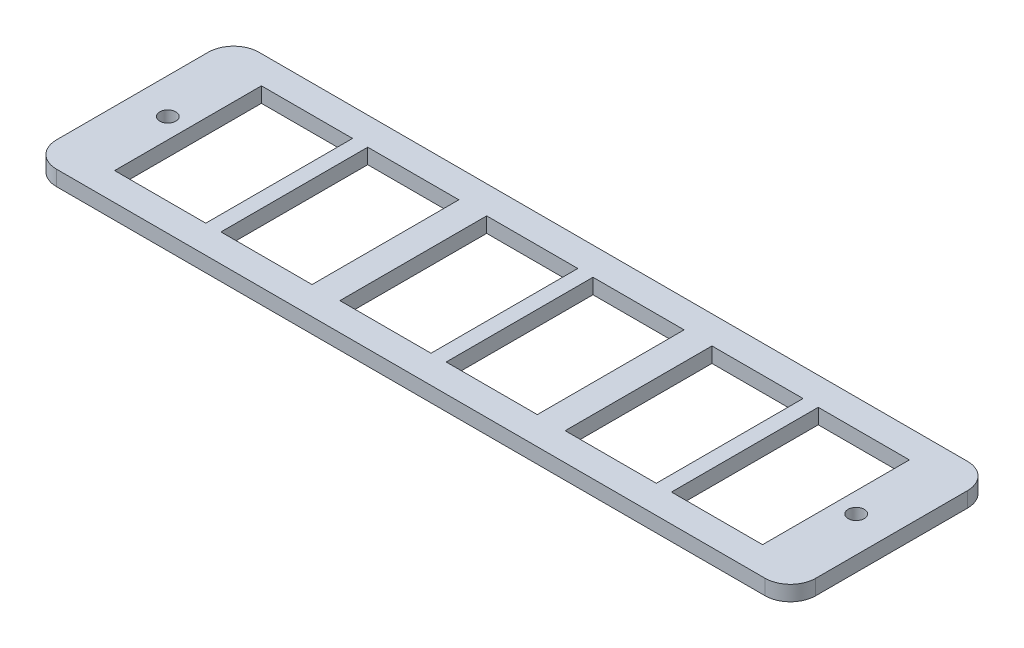
ISO-10303-21;
HEADER;
FILE_DESCRIPTION(('STEP AP214'),'2;1');
FILE_NAME('part.step','',(''),(''),'','','');
FILE_SCHEMA(('AUTOMOTIVE_DESIGN { 1 0 10303 214 1 1 1 1 }'));
ENDSEC;
DATA;
#1=APPLICATION_CONTEXT('core data for automotive mechanical design processes');
#2=APPLICATION_PROTOCOL_DEFINITION('international standard','automotive_design',2000,#1);
#3=PRODUCT_CONTEXT('',#1,'mechanical');
#4=PRODUCT('Part','Part','',(#3));
#5=PRODUCT_RELATED_PRODUCT_CATEGORY('part','',(#4));
#6=PRODUCT_DEFINITION_FORMATION('','',#4);
#7=PRODUCT_DEFINITION_CONTEXT('part definition',#1,'design');
#8=PRODUCT_DEFINITION('design','',#6,#7);
#9=PRODUCT_DEFINITION_SHAPE('','',#8);
#10=(LENGTH_UNIT() NAMED_UNIT(*) SI_UNIT(.MILLI.,.METRE.));
#11=(NAMED_UNIT(*) PLANE_ANGLE_UNIT() SI_UNIT($,.RADIAN.));
#12=(NAMED_UNIT(*) SI_UNIT($,.STERADIAN.) SOLID_ANGLE_UNIT());
#13=UNCERTAINTY_MEASURE_WITH_UNIT(LENGTH_MEASURE(1.E-05),#10,'distance_accuracy_value','');
#14=(GEOMETRIC_REPRESENTATION_CONTEXT(3) GLOBAL_UNCERTAINTY_ASSIGNED_CONTEXT((#13)) GLOBAL_UNIT_ASSIGNED_CONTEXT((#10,
#11,#12)) REPRESENTATION_CONTEXT('',''));
#15=CARTESIAN_POINT('',(0.,0.,0.));
#16=DIRECTION('',(0.,0.,1.));
#17=DIRECTION('',(1.,0.,0.));
#18=AXIS2_PLACEMENT_3D('',#15,#16,#17);
#19=CARTESIAN_POINT('',(0.,3.,0.));
#20=DIRECTION('',(0.,1.,0.));
#21=DIRECTION('',(0.,0.,1.));
#22=AXIS2_PLACEMENT_3D('',#19,#20,#21);
#23=PLANE('',#22);
#24=DIRECTION('',(0.,0.,-1.));
#25=VECTOR('',#24,1.);
#26=CARTESIAN_POINT('',(118.000000002136,3.,-10.4999999991346));
#27=LINE('',#26,#25);
#28=CARTESIAN_POINT('',(118.000000002136,3.,-10.4999999991346));
#29=VERTEX_POINT('',#28);
#30=CARTESIAN_POINT('',(118.000000002136,3.,-39.5));
#31=VERTEX_POINT('',#30);
#32=EDGE_CURVE('E287',#29,#31,#27,.T.);
#33=ORIENTED_EDGE('',*,*,#32,.F.);
#34=DIRECTION('',(1.,0.,0.));
#35=VECTOR('',#34,1.);
#36=CARTESIAN_POINT('',(100.000000002136,3.,-10.4999999991346));
#37=LINE('',#36,#35);
#38=CARTESIAN_POINT('',(100.000000002136,3.,-10.4999999991346));
#39=VERTEX_POINT('',#38);
#40=EDGE_CURVE('E285',#39,#29,#37,.T.);
#41=ORIENTED_EDGE('',*,*,#40,.F.);
#42=DIRECTION('',(0.,0.,1.));
#43=VECTOR('',#42,1.);
#44=CARTESIAN_POINT('',(100.000000002136,3.,-39.5));
#45=LINE('',#44,#43);
#46=CARTESIAN_POINT('',(100.000000002136,3.,-39.5));
#47=VERTEX_POINT('',#46);
#48=EDGE_CURVE('E293',#47,#39,#45,.T.);
#49=ORIENTED_EDGE('',*,*,#48,.F.);
#50=DIRECTION('',(-1.,0.,0.));
#51=VECTOR('',#50,1.);
#52=CARTESIAN_POINT('',(118.000000002136,3.,-39.5));
#53=LINE('',#52,#51);
#54=EDGE_CURVE('E290',#31,#47,#53,.T.);
#55=ORIENTED_EDGE('',*,*,#54,.F.);
#56=EDGE_LOOP('',(#33,#41,#49,#55));
#57=FACE_BOUND('',#56,.T.);
#58=CARTESIAN_POINT('',(143.,3.,-25.));
#59=DIRECTION('',(0.,1.,0.));
#60=DIRECTION('',(0.,0.,-1.));
#61=AXIS2_PLACEMENT_3D('',#58,#59,#60);
#62=CIRCLE('',#61,1.59999999999996);
#63=CARTESIAN_POINT('',(143.,3.,-26.6));
#64=VERTEX_POINT('',#63);
#65=EDGE_CURVE('E347',#64,#64,#62,.T.);
#66=ORIENTED_EDGE('',*,*,#65,.F.);
#67=EDGE_LOOP('',(#66));
#68=FACE_BOUND('',#67,.T.);
#69=DIRECTION('',(0.,0.,1.));
#70=VECTOR('',#69,1.);
#71=CARTESIAN_POINT('',(55.5,3.,-10.4999999991346));
#72=LINE('',#71,#70);
#73=CARTESIAN_POINT('',(55.5,3.,-39.5));
#74=VERTEX_POINT('',#73);
#75=CARTESIAN_POINT('',(55.5,3.,-10.4999999991346));
#76=VERTEX_POINT('',#75);
#77=EDGE_CURVE('E361',#74,#76,#72,.T.);
#78=ORIENTED_EDGE('',*,*,#77,.F.);
#79=DIRECTION('',(-1.,0.,0.));
#80=VECTOR('',#79,1.);
#81=CARTESIAN_POINT('',(55.5,3.,-39.5));
#82=LINE('',#81,#80);
#83=CARTESIAN_POINT('',(73.5,3.,-39.5));
#84=VERTEX_POINT('',#83);
#85=EDGE_CURVE('E359',#84,#74,#82,.T.);
#86=ORIENTED_EDGE('',*,*,#85,.F.);
#87=DIRECTION('',(0.,0.,-1.));
#88=VECTOR('',#87,1.);
#89=CARTESIAN_POINT('',(73.5,3.,-39.5));
#90=LINE('',#89,#88);
#91=CARTESIAN_POINT('',(73.5,3.,-10.4999999991346));
#92=VERTEX_POINT('',#91);
#93=EDGE_CURVE('E367',#92,#84,#90,.T.);
#94=ORIENTED_EDGE('',*,*,#93,.F.);
#95=DIRECTION('',(1.,0.,0.));
#96=VECTOR('',#95,1.);
#97=CARTESIAN_POINT('',(73.5,3.,-10.4999999991346));
#98=LINE('',#97,#96);
#99=EDGE_CURVE('E364',#76,#92,#98,.T.);
#100=ORIENTED_EDGE('',*,*,#99,.F.);
#101=EDGE_LOOP('',(#78,#86,#94,#100));
#102=FACE_BOUND('',#101,.T.);
#103=DIRECTION('',(0.,0.,-1.));
#104=VECTOR('',#103,1.);
#105=CARTESIAN_POINT('',(28.9999999978636,3.,-39.5));
#106=LINE('',#105,#104);
#107=CARTESIAN_POINT('',(28.9999999978636,3.,-10.4999999991346));
#108=VERTEX_POINT('',#107);
#109=CARTESIAN_POINT('',(28.9999999978636,3.,-39.5));
#110=VERTEX_POINT('',#109);
#111=EDGE_CURVE('E423',#108,#110,#106,.T.);
#112=ORIENTED_EDGE('',*,*,#111,.F.);
#113=DIRECTION('',(1.,0.,0.));
#114=VECTOR('',#113,1.);
#115=CARTESIAN_POINT('',(28.9999999978636,3.,-10.4999999991346));
#116=LINE('',#115,#114);
#117=CARTESIAN_POINT('',(10.9999999978636,3.,-10.4999999991346));
#118=VERTEX_POINT('',#117);
#119=EDGE_CURVE('E421',#118,#108,#116,.T.);
#120=ORIENTED_EDGE('',*,*,#119,.F.);
#121=DIRECTION('',(0.,0.,1.));
#122=VECTOR('',#121,1.);
#123=CARTESIAN_POINT('',(10.9999999978636,3.,-10.4999999991346));
#124=LINE('',#123,#122);
#125=CARTESIAN_POINT('',(10.9999999978636,3.,-39.5));
#126=VERTEX_POINT('',#125);
#127=EDGE_CURVE('E429',#126,#118,#124,.T.);
#128=ORIENTED_EDGE('',*,*,#127,.F.);
#129=DIRECTION('',(-1.,0.,0.));
#130=VECTOR('',#129,1.);
#131=CARTESIAN_POINT('',(10.9999999978636,3.,-39.5));
#132=LINE('',#131,#130);
#133=EDGE_CURVE('E426',#110,#126,#132,.T.);
#134=ORIENTED_EDGE('',*,*,#133,.F.);
#135=EDGE_LOOP('',(#112,#120,#128,#134));
#136=FACE_BOUND('',#135,.T.);
#137=DIRECTION('',(1.,0.,0.));
#138=VECTOR('',#137,1.);
#139=CARTESIAN_POINT('',(0.,3.,-5.));
#140=LINE('',#139,#138);
#141=CARTESIAN_POINT('',(5.,3.,-5.));
#142=VERTEX_POINT('',#141);
#143=CARTESIAN_POINT('',(145.,3.,-5.));
#144=VERTEX_POINT('',#143);
#145=EDGE_CURVE('E455',#142,#144,#140,.T.);
#146=ORIENTED_EDGE('',*,*,#145,.T.);
#147=CARTESIAN_POINT('',(145.,3.,-10.));
#148=DIRECTION('',(0.,1.,0.));
#149=DIRECTION('',(0.,0.,1.));
#150=AXIS2_PLACEMENT_3D('',#147,#148,#149);
#151=CIRCLE('',#150,5.);
#152=CARTESIAN_POINT('',(150.,3.,-10.));
#153=VERTEX_POINT('',#152);
#154=EDGE_CURVE('E495',#144,#153,#151,.T.);
#155=ORIENTED_EDGE('',*,*,#154,.T.);
#156=DIRECTION('',(0.,0.,-1.));
#157=VECTOR('',#156,1.);
#158=CARTESIAN_POINT('',(150.,3.,-45.));
#159=LINE('',#158,#157);
#160=CARTESIAN_POINT('',(150.,3.,-40.));
#161=VERTEX_POINT('',#160);
#162=EDGE_CURVE('E459',#153,#161,#159,.T.);
#163=ORIENTED_EDGE('',*,*,#162,.T.);
#164=CARTESIAN_POINT('',(145.,3.,-40.));
#165=DIRECTION('',(0.,1.,0.));
#166=DIRECTION('',(0.,0.,1.));
#167=AXIS2_PLACEMENT_3D('',#164,#165,#166);
#168=CIRCLE('',#167,5.);
#169=CARTESIAN_POINT('',(145.,3.,-45.));
#170=VERTEX_POINT('',#169);
#171=EDGE_CURVE('E55',#161,#170,#168,.T.);
#172=ORIENTED_EDGE('',*,*,#171,.T.);
#173=DIRECTION('',(-1.,0.,0.));
#174=VECTOR('',#173,1.);
#175=CARTESIAN_POINT('',(0.,3.,-45.));
#176=LINE('',#175,#174);
#177=CARTESIAN_POINT('',(5.,3.,-45.));
#178=VERTEX_POINT('',#177);
#179=EDGE_CURVE('E461',#170,#178,#176,.T.);
#180=ORIENTED_EDGE('',*,*,#179,.T.);
#181=CARTESIAN_POINT('',(5.,3.,-40.));
#182=DIRECTION('',(0.,1.,0.));
#183=DIRECTION('',(0.,0.,1.));
#184=AXIS2_PLACEMENT_3D('',#181,#182,#183);
#185=CIRCLE('',#184,5.);
#186=CARTESIAN_POINT('',(0.,3.,-40.));
#187=VERTEX_POINT('',#186);
#188=EDGE_CURVE('E490',#178,#187,#185,.T.);
#189=ORIENTED_EDGE('',*,*,#188,.T.);
#190=DIRECTION('',(0.,0.,1.));
#191=VECTOR('',#190,1.);
#192=CARTESIAN_POINT('',(0.,3.,-45.));
#193=LINE('',#192,#191);
#194=CARTESIAN_POINT('',(0.,3.,-10.));
#195=VERTEX_POINT('',#194);
#196=EDGE_CURVE('E452',#187,#195,#193,.T.);
#197=ORIENTED_EDGE('',*,*,#196,.T.);
#198=CARTESIAN_POINT('',(5.,3.,-10.));
#199=DIRECTION('',(0.,1.,0.));
#200=DIRECTION('',(0.,0.,1.));
#201=AXIS2_PLACEMENT_3D('',#198,#199,#200);
#202=CIRCLE('',#201,5.);
#203=EDGE_CURVE('E492',#195,#142,#202,.T.);
#204=ORIENTED_EDGE('',*,*,#203,.T.);
#205=EDGE_LOOP('',(#146,#155,#163,#172,#180,#189,#197,#204));
#206=FACE_BOUND('',#205,.T.);
#207=DIRECTION('',(0.,0.,-1.));
#208=VECTOR('',#207,1.);
#209=CARTESIAN_POINT('',(49.9999999978636,3.,-39.5));
#210=LINE('',#209,#208);
#211=CARTESIAN_POINT('',(49.9999999978636,3.,-10.4999999991346));
#212=VERTEX_POINT('',#211);
#213=CARTESIAN_POINT('',(49.9999999978636,3.,-39.5));
#214=VERTEX_POINT('',#213);
#215=EDGE_CURVE('E392',#212,#214,#210,.T.);
#216=ORIENTED_EDGE('',*,*,#215,.F.);
#217=DIRECTION('',(1.,0.,0.));
#218=VECTOR('',#217,1.);
#219=CARTESIAN_POINT('',(49.9999999978636,3.,-10.4999999991346));
#220=LINE('',#219,#218);
#221=CARTESIAN_POINT('',(31.9999999978636,3.,-10.4999999991346));
#222=VERTEX_POINT('',#221);
#223=EDGE_CURVE('E390',#222,#212,#220,.T.);
#224=ORIENTED_EDGE('',*,*,#223,.F.);
#225=DIRECTION('',(0.,0.,1.));
#226=VECTOR('',#225,1.);
#227=CARTESIAN_POINT('',(31.9999999978636,3.,-10.4999999991346));
#228=LINE('',#227,#226);
#229=CARTESIAN_POINT('',(31.9999999978636,3.,-39.5));
#230=VERTEX_POINT('',#229);
#231=EDGE_CURVE('E398',#230,#222,#228,.T.);
#232=ORIENTED_EDGE('',*,*,#231,.F.);
#233=DIRECTION('',(-1.,0.,0.));
#234=VECTOR('',#233,1.);
#235=CARTESIAN_POINT('',(31.9999999978636,3.,-39.5));
#236=LINE('',#235,#234);
#237=EDGE_CURVE('E395',#214,#230,#236,.T.);
#238=ORIENTED_EDGE('',*,*,#237,.F.);
#239=EDGE_LOOP('',(#216,#224,#232,#238));
#240=FACE_BOUND('',#239,.T.);
#241=CARTESIAN_POINT('',(7.,3.,-25.));
#242=DIRECTION('',(0.,1.,0.));
#243=DIRECTION('',(0.,0.,1.));
#244=AXIS2_PLACEMENT_3D('',#241,#242,#243);
#245=CIRCLE('',#244,1.6);
#246=CARTESIAN_POINT('',(7.,3.,-23.4));
#247=VERTEX_POINT('',#246);
#248=EDGE_CURVE('E353',#247,#247,#245,.T.);
#249=ORIENTED_EDGE('',*,*,#248,.F.);
#250=EDGE_LOOP('',(#249));
#251=FACE_BOUND('',#250,.T.);
#252=DIRECTION('',(0.,0.,1.));
#253=VECTOR('',#252,1.);
#254=CARTESIAN_POINT('',(76.5,3.,-39.5));
#255=LINE('',#254,#253);
#256=CARTESIAN_POINT('',(76.5,3.,-39.5));
#257=VERTEX_POINT('',#256);
#258=CARTESIAN_POINT('',(76.5,3.,-10.4999999991346));
#259=VERTEX_POINT('',#258);
#260=EDGE_CURVE('E318',#257,#259,#255,.T.);
#261=ORIENTED_EDGE('',*,*,#260,.F.);
#262=DIRECTION('',(-1.,0.,0.));
#263=VECTOR('',#262,1.);
#264=CARTESIAN_POINT('',(94.5,3.,-39.5));
#265=LINE('',#264,#263);
#266=CARTESIAN_POINT('',(94.5,3.,-39.5));
#267=VERTEX_POINT('',#266);
#268=EDGE_CURVE('E316',#267,#257,#265,.T.);
#269=ORIENTED_EDGE('',*,*,#268,.F.);
#270=DIRECTION('',(0.,0.,-1.));
#271=VECTOR('',#270,1.);
#272=CARTESIAN_POINT('',(94.5,3.,-10.4999999991346));
#273=LINE('',#272,#271);
#274=CARTESIAN_POINT('',(94.5,3.,-10.4999999991346));
#275=VERTEX_POINT('',#274);
#276=EDGE_CURVE('E324',#275,#267,#273,.T.);
#277=ORIENTED_EDGE('',*,*,#276,.F.);
#278=DIRECTION('',(1.,0.,0.));
#279=VECTOR('',#278,1.);
#280=CARTESIAN_POINT('',(76.5,3.,-10.4999999991346));
#281=LINE('',#280,#279);
#282=EDGE_CURVE('E321',#259,#275,#281,.T.);
#283=ORIENTED_EDGE('',*,*,#282,.F.);
#284=EDGE_LOOP('',(#261,#269,#277,#283));
#285=FACE_BOUND('',#284,.T.);
#286=DIRECTION('',(0.,0.,-1.));
#287=VECTOR('',#286,1.);
#288=CARTESIAN_POINT('',(139.000000002136,3.,-10.4999999991346));
#289=LINE('',#288,#287);
#290=CARTESIAN_POINT('',(139.000000002136,3.,-10.4999999991346));
#291=VERTEX_POINT('',#290);
#292=CARTESIAN_POINT('',(139.000000002136,3.,-39.5));
#293=VERTEX_POINT('',#292);
#294=EDGE_CURVE('E254',#291,#293,#289,.T.);
#295=ORIENTED_EDGE('',*,*,#294,.F.);
#296=DIRECTION('',(1.,0.,0.));
#297=VECTOR('',#296,1.);
#298=CARTESIAN_POINT('',(121.000000002136,3.,-10.4999999991346));
#299=LINE('',#298,#297);
#300=CARTESIAN_POINT('',(121.000000002136,3.,-10.4999999991346));
#301=VERTEX_POINT('',#300);
#302=EDGE_CURVE('E244',#301,#291,#299,.T.);
#303=ORIENTED_EDGE('',*,*,#302,.F.);
#304=DIRECTION('',(0.,0.,1.));
#305=VECTOR('',#304,1.);
#306=CARTESIAN_POINT('',(121.000000002136,3.,-39.5));
#307=LINE('',#306,#305);
#308=CARTESIAN_POINT('',(121.000000002136,3.,-39.5));
#309=VERTEX_POINT('',#308);
#310=EDGE_CURVE('E269',#309,#301,#307,.T.);
#311=ORIENTED_EDGE('',*,*,#310,.F.);
#312=DIRECTION('',(-1.,0.,0.));
#313=VECTOR('',#312,1.);
#314=CARTESIAN_POINT('',(139.000000002136,3.,-39.5));
#315=LINE('',#314,#313);
#316=EDGE_CURVE('E267',#293,#309,#315,.T.);
#317=ORIENTED_EDGE('',*,*,#316,.F.);
#318=EDGE_LOOP('',(#295,#303,#311,#317));
#319=FACE_BOUND('',#318,.T.);
#320=ADVANCED_FACE('F33',(#57,#68,#102,#136,#206,#240,#251,#285,#319),#23,.T.);
#321=CARTESIAN_POINT('',(0.,0.,0.));
#322=DIRECTION('',(0.,1.,0.));
#323=DIRECTION('',(0.,0.,1.));
#324=AXIS2_PLACEMENT_3D('',#321,#322,#323);
#325=PLANE('',#324);
#326=DIRECTION('',(1.,0.,0.));
#327=VECTOR('',#326,1.);
#328=CARTESIAN_POINT('',(100.000000002136,0.,-10.4999999991346));
#329=LINE('',#328,#327);
#330=CARTESIAN_POINT('',(100.000000002136,0.,-10.4999999991346));
#331=VERTEX_POINT('',#330);
#332=CARTESIAN_POINT('',(118.000000002136,0.,-10.4999999991346));
#333=VERTEX_POINT('',#332);
#334=EDGE_CURVE('E262',#331,#333,#329,.T.);
#335=ORIENTED_EDGE('',*,*,#334,.T.);
#336=DIRECTION('',(0.,0.,-1.));
#337=VECTOR('',#336,1.);
#338=CARTESIAN_POINT('',(118.000000002136,0.,-10.4999999991346));
#339=LINE('',#338,#337);
#340=CARTESIAN_POINT('',(118.000000002136,0.,-39.5));
#341=VERTEX_POINT('',#340);
#342=EDGE_CURVE('E298',#333,#341,#339,.T.);
#343=ORIENTED_EDGE('',*,*,#342,.T.);
#344=DIRECTION('',(-1.,0.,0.));
#345=VECTOR('',#344,1.);
#346=CARTESIAN_POINT('',(118.000000002136,0.,-39.5));
#347=LINE('',#346,#345);
#348=CARTESIAN_POINT('',(100.000000002136,0.,-39.5));
#349=VERTEX_POINT('',#348);
#350=EDGE_CURVE('E301',#341,#349,#347,.T.);
#351=ORIENTED_EDGE('',*,*,#350,.T.);
#352=DIRECTION('',(0.,0.,1.));
#353=VECTOR('',#352,1.);
#354=CARTESIAN_POINT('',(100.000000002136,0.,-39.5));
#355=LINE('',#354,#353);
#356=EDGE_CURVE('E288',#349,#331,#355,.T.);
#357=ORIENTED_EDGE('',*,*,#356,.T.);
#358=EDGE_LOOP('',(#335,#343,#351,#357));
#359=FACE_BOUND('',#358,.T.);
#360=CARTESIAN_POINT('',(143.,0.,-25.));
#361=DIRECTION('',(0.,1.,0.));
#362=DIRECTION('',(0.,0.,-1.));
#363=AXIS2_PLACEMENT_3D('',#360,#361,#362);
#364=CIRCLE('',#363,1.59999999999996);
#365=CARTESIAN_POINT('',(143.,0.,-26.6));
#366=VERTEX_POINT('',#365);
#367=EDGE_CURVE('E346',#366,#366,#364,.T.);
#368=ORIENTED_EDGE('',*,*,#367,.T.);
#369=EDGE_LOOP('',(#368));
#370=FACE_BOUND('',#369,.T.);
#371=DIRECTION('',(-1.,0.,0.));
#372=VECTOR('',#371,1.);
#373=CARTESIAN_POINT('',(55.5,0.,-39.5));
#374=LINE('',#373,#372);
#375=CARTESIAN_POINT('',(73.5,0.,-39.5));
#376=VERTEX_POINT('',#375);
#377=CARTESIAN_POINT('',(55.5,0.,-39.5));
#378=VERTEX_POINT('',#377);
#379=EDGE_CURVE('E356',#376,#378,#374,.T.);
#380=ORIENTED_EDGE('',*,*,#379,.T.);
#381=DIRECTION('',(0.,0.,1.));
#382=VECTOR('',#381,1.);
#383=CARTESIAN_POINT('',(55.5,0.,-10.4999999991346));
#384=LINE('',#383,#382);
#385=CARTESIAN_POINT('',(55.5,0.,-10.4999999991346));
#386=VERTEX_POINT('',#385);
#387=EDGE_CURVE('E372',#378,#386,#384,.T.);
#388=ORIENTED_EDGE('',*,*,#387,.T.);
#389=DIRECTION('',(1.,0.,0.));
#390=VECTOR('',#389,1.);
#391=CARTESIAN_POINT('',(73.5,0.,-10.4999999991346));
#392=LINE('',#391,#390);
#393=CARTESIAN_POINT('',(73.5,0.,-10.4999999991346));
#394=VERTEX_POINT('',#393);
#395=EDGE_CURVE('E375',#386,#394,#392,.T.);
#396=ORIENTED_EDGE('',*,*,#395,.T.);
#397=DIRECTION('',(0.,0.,-1.));
#398=VECTOR('',#397,1.);
#399=CARTESIAN_POINT('',(73.5,0.,-39.5));
#400=LINE('',#399,#398);
#401=EDGE_CURVE('E362',#394,#376,#400,.T.);
#402=ORIENTED_EDGE('',*,*,#401,.T.);
#403=EDGE_LOOP('',(#380,#388,#396,#402));
#404=FACE_BOUND('',#403,.T.);
#405=DIRECTION('',(1.,0.,0.));
#406=VECTOR('',#405,1.);
#407=CARTESIAN_POINT('',(28.9999999978636,0.,-10.4999999991346));
#408=LINE('',#407,#406);
#409=CARTESIAN_POINT('',(10.9999999978636,0.,-10.4999999991346));
#410=VERTEX_POINT('',#409);
#411=CARTESIAN_POINT('',(28.9999999978636,0.,-10.4999999991346));
#412=VERTEX_POINT('',#411);
#413=EDGE_CURVE('E420',#410,#412,#408,.T.);
#414=ORIENTED_EDGE('',*,*,#413,.T.);
#415=DIRECTION('',(0.,0.,-1.));
#416=VECTOR('',#415,1.);
#417=CARTESIAN_POINT('',(28.9999999978636,0.,-39.5));
#418=LINE('',#417,#416);
#419=CARTESIAN_POINT('',(28.9999999978636,0.,-39.5));
#420=VERTEX_POINT('',#419);
#421=EDGE_CURVE('E434',#412,#420,#418,.T.);
#422=ORIENTED_EDGE('',*,*,#421,.T.);
#423=DIRECTION('',(-1.,0.,0.));
#424=VECTOR('',#423,1.);
#425=CARTESIAN_POINT('',(10.9999999978636,0.,-39.5));
#426=LINE('',#425,#424);
#427=CARTESIAN_POINT('',(10.9999999978636,0.,-39.5));
#428=VERTEX_POINT('',#427);
#429=EDGE_CURVE('E437',#420,#428,#426,.T.);
#430=ORIENTED_EDGE('',*,*,#429,.T.);
#431=DIRECTION('',(0.,0.,1.));
#432=VECTOR('',#431,1.);
#433=CARTESIAN_POINT('',(10.9999999978636,0.,-10.4999999991346));
#434=LINE('',#433,#432);
#435=EDGE_CURVE('E424',#428,#410,#434,.T.);
#436=ORIENTED_EDGE('',*,*,#435,.T.);
#437=EDGE_LOOP('',(#414,#422,#430,#436));
#438=FACE_BOUND('',#437,.T.);
#439=DIRECTION('',(0.,0.,-1.));
#440=VECTOR('',#439,1.);
#441=CARTESIAN_POINT('',(150.,0.,-45.));
#442=LINE('',#441,#440);
#443=CARTESIAN_POINT('',(150.,0.,-10.));
#444=VERTEX_POINT('',#443);
#445=CARTESIAN_POINT('',(150.,0.,-40.));
#446=VERTEX_POINT('',#445);
#447=EDGE_CURVE('E469',#444,#446,#442,.T.);
#448=ORIENTED_EDGE('',*,*,#447,.F.);
#449=CARTESIAN_POINT('',(145.,0.,-10.));
#450=DIRECTION('',(0.,1.,0.));
#451=DIRECTION('',(0.,0.,1.));
#452=AXIS2_PLACEMENT_3D('',#449,#450,#451);
#453=CIRCLE('',#452,5.);
#454=CARTESIAN_POINT('',(145.,0.,-5.));
#455=VERTEX_POINT('',#454);
#456=EDGE_CURVE('E483',#444,#455,#453,.F.);
#457=ORIENTED_EDGE('',*,*,#456,.T.);
#458=DIRECTION('',(1.,0.,0.));
#459=VECTOR('',#458,1.);
#460=CARTESIAN_POINT('',(0.,0.,-5.));
#461=LINE('',#460,#459);
#462=CARTESIAN_POINT('',(5.,0.,-5.));
#463=VERTEX_POINT('',#462);
#464=EDGE_CURVE('E466',#463,#455,#461,.T.);
#465=ORIENTED_EDGE('',*,*,#464,.F.);
#466=CARTESIAN_POINT('',(5.,0.,-10.));
#467=DIRECTION('',(0.,1.,0.));
#468=DIRECTION('',(0.,0.,1.));
#469=AXIS2_PLACEMENT_3D('',#466,#467,#468);
#470=CIRCLE('',#469,5.);
#471=CARTESIAN_POINT('',(0.,0.,-10.));
#472=VERTEX_POINT('',#471);
#473=EDGE_CURVE('E479',#463,#472,#470,.F.);
#474=ORIENTED_EDGE('',*,*,#473,.T.);
#475=DIRECTION('',(0.,0.,1.));
#476=VECTOR('',#475,1.);
#477=CARTESIAN_POINT('',(0.,0.,-45.));
#478=LINE('',#477,#476);
#479=CARTESIAN_POINT('',(0.,0.,-40.));
#480=VERTEX_POINT('',#479);
#481=EDGE_CURVE('E451',#480,#472,#478,.T.);
#482=ORIENTED_EDGE('',*,*,#481,.F.);
#483=CARTESIAN_POINT('',(5.,0.,-40.));
#484=DIRECTION('',(0.,1.,0.));
#485=DIRECTION('',(0.,0.,1.));
#486=AXIS2_PLACEMENT_3D('',#483,#484,#485);
#487=CIRCLE('',#486,5.);
#488=CARTESIAN_POINT('',(5.,0.,-45.));
#489=VERTEX_POINT('',#488);
#490=EDGE_CURVE('E477',#480,#489,#487,.F.);
#491=ORIENTED_EDGE('',*,*,#490,.T.);
#492=DIRECTION('',(-1.,0.,0.));
#493=VECTOR('',#492,1.);
#494=CARTESIAN_POINT('',(0.,0.,-45.));
#495=LINE('',#494,#493);
#496=CARTESIAN_POINT('',(145.,0.,-45.));
#497=VERTEX_POINT('',#496);
#498=EDGE_CURVE('E456',#497,#489,#495,.T.);
#499=ORIENTED_EDGE('',*,*,#498,.F.);
#500=CARTESIAN_POINT('',(145.,0.,-40.));
#501=DIRECTION('',(0.,1.,0.));
#502=DIRECTION('',(0.,0.,1.));
#503=AXIS2_PLACEMENT_3D('',#500,#501,#502);
#504=CIRCLE('',#503,5.);
#505=EDGE_CURVE('E481',#497,#446,#504,.F.);
#506=ORIENTED_EDGE('',*,*,#505,.T.);
#507=EDGE_LOOP('',(#448,#457,#465,#474,#482,#491,#499,#506));
#508=FACE_BOUND('',#507,.T.);
#509=DIRECTION('',(1.,0.,0.));
#510=VECTOR('',#509,1.);
#511=CARTESIAN_POINT('',(49.9999999978636,0.,-10.4999999991346));
#512=LINE('',#511,#510);
#513=CARTESIAN_POINT('',(31.9999999978636,0.,-10.4999999991346));
#514=VERTEX_POINT('',#513);
#515=CARTESIAN_POINT('',(49.9999999978636,0.,-10.4999999991346));
#516=VERTEX_POINT('',#515);
#517=EDGE_CURVE('E389',#514,#516,#512,.T.);
#518=ORIENTED_EDGE('',*,*,#517,.T.);
#519=DIRECTION('',(0.,0.,-1.));
#520=VECTOR('',#519,1.);
#521=CARTESIAN_POINT('',(49.9999999978636,0.,-39.5));
#522=LINE('',#521,#520);
#523=CARTESIAN_POINT('',(49.9999999978636,0.,-39.5));
#524=VERTEX_POINT('',#523);
#525=EDGE_CURVE('E403',#516,#524,#522,.T.);
#526=ORIENTED_EDGE('',*,*,#525,.T.);
#527=DIRECTION('',(-1.,0.,0.));
#528=VECTOR('',#527,1.);
#529=CARTESIAN_POINT('',(31.9999999978636,0.,-39.5));
#530=LINE('',#529,#528);
#531=CARTESIAN_POINT('',(31.9999999978636,0.,-39.5));
#532=VERTEX_POINT('',#531);
#533=EDGE_CURVE('E406',#524,#532,#530,.T.);
#534=ORIENTED_EDGE('',*,*,#533,.T.);
#535=DIRECTION('',(0.,0.,1.));
#536=VECTOR('',#535,1.);
#537=CARTESIAN_POINT('',(31.9999999978636,0.,-10.4999999991346));
#538=LINE('',#537,#536);
#539=EDGE_CURVE('E393',#532,#514,#538,.T.);
#540=ORIENTED_EDGE('',*,*,#539,.T.);
#541=EDGE_LOOP('',(#518,#526,#534,#540));
#542=FACE_BOUND('',#541,.T.);
#543=CARTESIAN_POINT('',(7.,0.,-25.));
#544=DIRECTION('',(0.,1.,0.));
#545=DIRECTION('',(0.,0.,1.));
#546=AXIS2_PLACEMENT_3D('',#543,#544,#545);
#547=CIRCLE('',#546,1.6);
#548=CARTESIAN_POINT('',(7.,0.,-23.4));
#549=VERTEX_POINT('',#548);
#550=EDGE_CURVE('E350',#549,#549,#547,.T.);
#551=ORIENTED_EDGE('',*,*,#550,.T.);
#552=EDGE_LOOP('',(#551));
#553=FACE_BOUND('',#552,.T.);
#554=DIRECTION('',(-1.,0.,0.));
#555=VECTOR('',#554,1.);
#556=CARTESIAN_POINT('',(94.5,0.,-39.5));
#557=LINE('',#556,#555);
#558=CARTESIAN_POINT('',(94.5,0.,-39.5));
#559=VERTEX_POINT('',#558);
#560=CARTESIAN_POINT('',(76.5,0.,-39.5));
#561=VERTEX_POINT('',#560);
#562=EDGE_CURVE('E315',#559,#561,#557,.T.);
#563=ORIENTED_EDGE('',*,*,#562,.T.);
#564=DIRECTION('',(0.,0.,1.));
#565=VECTOR('',#564,1.);
#566=CARTESIAN_POINT('',(76.5,0.,-39.5));
#567=LINE('',#566,#565);
#568=CARTESIAN_POINT('',(76.5,0.,-10.4999999991346));
#569=VERTEX_POINT('',#568);
#570=EDGE_CURVE('E329',#561,#569,#567,.T.);
#571=ORIENTED_EDGE('',*,*,#570,.T.);
#572=DIRECTION('',(1.,0.,0.));
#573=VECTOR('',#572,1.);
#574=CARTESIAN_POINT('',(76.5,0.,-10.4999999991346));
#575=LINE('',#574,#573);
#576=CARTESIAN_POINT('',(94.5,0.,-10.4999999991346));
#577=VERTEX_POINT('',#576);
#578=EDGE_CURVE('E332',#569,#577,#575,.T.);
#579=ORIENTED_EDGE('',*,*,#578,.T.);
#580=DIRECTION('',(0.,0.,-1.));
#581=VECTOR('',#580,1.);
#582=CARTESIAN_POINT('',(94.5,0.,-10.4999999991346));
#583=LINE('',#582,#581);
#584=EDGE_CURVE('E319',#577,#559,#583,.T.);
#585=ORIENTED_EDGE('',*,*,#584,.T.);
#586=EDGE_LOOP('',(#563,#571,#579,#585));
#587=FACE_BOUND('',#586,.T.);
#588=DIRECTION('',(1.,0.,0.));
#589=VECTOR('',#588,1.);
#590=CARTESIAN_POINT('',(121.000000002136,0.,-10.4999999991346));
#591=LINE('',#590,#589);
#592=CARTESIAN_POINT('',(121.000000002136,0.,-10.4999999991346));
#593=VERTEX_POINT('',#592);
#594=CARTESIAN_POINT('',(139.000000002136,0.,-10.4999999991346));
#595=VERTEX_POINT('',#594);
#596=EDGE_CURVE('E273',#593,#595,#591,.T.);
#597=ORIENTED_EDGE('',*,*,#596,.T.);
#598=DIRECTION('',(0.,0.,-1.));
#599=VECTOR('',#598,1.);
#600=CARTESIAN_POINT('',(139.000000002136,0.,-10.4999999991346));
#601=LINE('',#600,#599);
#602=CARTESIAN_POINT('',(139.000000002136,0.,-39.5));
#603=VERTEX_POINT('',#602);
#604=EDGE_CURVE('E261',#595,#603,#601,.T.);
#605=ORIENTED_EDGE('',*,*,#604,.T.);
#606=DIRECTION('',(-1.,0.,0.));
#607=VECTOR('',#606,1.);
#608=CARTESIAN_POINT('',(139.000000002136,0.,-39.5));
#609=LINE('',#608,#607);
#610=CARTESIAN_POINT('',(121.000000002136,0.,-39.5));
#611=VERTEX_POINT('',#610);
#612=EDGE_CURVE('E276',#603,#611,#609,.T.);
#613=ORIENTED_EDGE('',*,*,#612,.T.);
#614=DIRECTION('',(0.,0.,1.));
#615=VECTOR('',#614,1.);
#616=CARTESIAN_POINT('',(121.000000002136,0.,-39.5));
#617=LINE('',#616,#615);
#618=EDGE_CURVE('E255',#611,#593,#617,.T.);
#619=ORIENTED_EDGE('',*,*,#618,.T.);
#620=EDGE_LOOP('',(#597,#605,#613,#619));
#621=FACE_BOUND('',#620,.T.);
#622=ADVANCED_FACE('F511',(#359,#370,#404,#438,#508,#542,#553,#587,#621),#325,.F.);
#623=CARTESIAN_POINT('',(0.,3.,-45.));
#624=DIRECTION('',(1.,0.,0.));
#625=DIRECTION('',(0.,0.,-1.));
#626=AXIS2_PLACEMENT_3D('',#623,#624,#625);
#627=PLANE('',#626);
#628=ORIENTED_EDGE('',*,*,#481,.T.);
#629=DIRECTION('',(0.,-1.,0.));
#630=VECTOR('',#629,1.);
#631=CARTESIAN_POINT('',(0.,3.,-10.));
#632=LINE('',#631,#630);
#633=EDGE_CURVE('E11',#472,#195,#632,.F.);
#634=ORIENTED_EDGE('',*,*,#633,.T.);
#635=ORIENTED_EDGE('',*,*,#196,.F.);
#636=DIRECTION('',(0.,-1.,0.));
#637=VECTOR('',#636,1.);
#638=CARTESIAN_POINT('',(0.,3.,-40.));
#639=LINE('',#638,#637);
#640=EDGE_CURVE('E41',#187,#480,#639,.T.);
#641=ORIENTED_EDGE('',*,*,#640,.T.);
#642=EDGE_LOOP('',(#628,#634,#635,#641));
#643=FACE_BOUND('',#642,.T.);
#644=ADVANCED_FACE('F505',(#643),#627,.F.);
#645=CARTESIAN_POINT('',(0.,3.,-5.));
#646=DIRECTION('',(0.,0.,-1.));
#647=DIRECTION('',(-1.,0.,0.));
#648=AXIS2_PLACEMENT_3D('',#645,#646,#647);
#649=PLANE('',#648);
#650=ORIENTED_EDGE('',*,*,#464,.T.);
#651=DIRECTION('',(0.,-1.,0.));
#652=VECTOR('',#651,1.);
#653=CARTESIAN_POINT('',(145.,3.,-5.));
#654=LINE('',#653,#652);
#655=EDGE_CURVE('E488',#455,#144,#654,.F.);
#656=ORIENTED_EDGE('',*,*,#655,.T.);
#657=ORIENTED_EDGE('',*,*,#145,.F.);
#658=DIRECTION('',(0.,-1.,0.));
#659=VECTOR('',#658,1.);
#660=CARTESIAN_POINT('',(5.,3.,-5.));
#661=LINE('',#660,#659);
#662=EDGE_CURVE('E485',#142,#463,#661,.T.);
#663=ORIENTED_EDGE('',*,*,#662,.T.);
#664=EDGE_LOOP('',(#650,#656,#657,#663));
#665=FACE_BOUND('',#664,.T.);
#666=ADVANCED_FACE('F521',(#665),#649,.F.);
#667=CARTESIAN_POINT('',(150.,3.,-45.));
#668=DIRECTION('',(-1.,0.,0.));
#669=DIRECTION('',(0.,0.,1.));
#670=AXIS2_PLACEMENT_3D('',#667,#668,#669);
#671=PLANE('',#670);
#672=ORIENTED_EDGE('',*,*,#162,.F.);
#673=DIRECTION('',(0.,-1.,0.));
#674=VECTOR('',#673,1.);
#675=CARTESIAN_POINT('',(150.,3.,-10.));
#676=LINE('',#675,#674);
#677=EDGE_CURVE('E474',#153,#444,#676,.T.);
#678=ORIENTED_EDGE('',*,*,#677,.T.);
#679=ORIENTED_EDGE('',*,*,#447,.T.);
#680=DIRECTION('',(0.,-1.,0.));
#681=VECTOR('',#680,1.);
#682=CARTESIAN_POINT('',(150.,3.,-40.));
#683=LINE('',#682,#681);
#684=EDGE_CURVE('E463',#446,#161,#683,.F.);
#685=ORIENTED_EDGE('',*,*,#684,.T.);
#686=EDGE_LOOP('',(#672,#678,#679,#685));
#687=FACE_BOUND('',#686,.T.);
#688=ADVANCED_FACE('F530',(#687),#671,.F.);
#689=CARTESIAN_POINT('',(0.,3.,-45.));
#690=DIRECTION('',(0.,0.,1.));
#691=DIRECTION('',(1.,0.,0.));
#692=AXIS2_PLACEMENT_3D('',#689,#690,#691);
#693=PLANE('',#692);
#694=ORIENTED_EDGE('',*,*,#179,.F.);
#695=DIRECTION('',(0.,-1.,0.));
#696=VECTOR('',#695,1.);
#697=CARTESIAN_POINT('',(145.,3.,-45.));
#698=LINE('',#697,#696);
#699=EDGE_CURVE('E498',#170,#497,#698,.T.);
#700=ORIENTED_EDGE('',*,*,#699,.T.);
#701=ORIENTED_EDGE('',*,*,#498,.T.);
#702=DIRECTION('',(0.,-1.,0.));
#703=VECTOR('',#702,1.);
#704=CARTESIAN_POINT('',(5.,3.,-45.));
#705=LINE('',#704,#703);
#706=EDGE_CURVE('E48',#489,#178,#705,.F.);
#707=ORIENTED_EDGE('',*,*,#706,.T.);
#708=EDGE_LOOP('',(#694,#700,#701,#707));
#709=FACE_BOUND('',#708,.T.);
#710=ADVANCED_FACE('F535',(#709),#693,.F.);
#711=CARTESIAN_POINT('',(28.9999999978636,3.,-10.4999999991346));
#712=DIRECTION('',(0.,0.,-1.));
#713=DIRECTION('',(-1.,0.,0.));
#714=AXIS2_PLACEMENT_3D('',#711,#712,#713);
#715=PLANE('',#714);
#716=ORIENTED_EDGE('',*,*,#413,.F.);
#717=DIRECTION('',(0.,-1.,0.));
#718=VECTOR('',#717,1.);
#719=CARTESIAN_POINT('',(10.9999999978636,3.,-10.4999999991346));
#720=LINE('',#719,#718);
#721=EDGE_CURVE('E431',#118,#410,#720,.T.);
#722=ORIENTED_EDGE('',*,*,#721,.F.);
#723=ORIENTED_EDGE('',*,*,#119,.T.);
#724=DIRECTION('',(0.,-1.,0.));
#725=VECTOR('',#724,1.);
#726=CARTESIAN_POINT('',(28.9999999978636,3.,-10.4999999991346));
#727=LINE('',#726,#725);
#728=EDGE_CURVE('E448',#108,#412,#727,.T.);
#729=ORIENTED_EDGE('',*,*,#728,.T.);
#730=EDGE_LOOP('',(#716,#722,#723,#729));
#731=FACE_BOUND('',#730,.T.);
#732=ADVANCED_FACE('F551',(#731),#715,.T.);
#733=CARTESIAN_POINT('',(28.9999999978636,3.,-39.5));
#734=DIRECTION('',(-1.,0.,0.));
#735=DIRECTION('',(0.,0.,1.));
#736=AXIS2_PLACEMENT_3D('',#733,#734,#735);
#737=PLANE('',#736);
#738=ORIENTED_EDGE('',*,*,#421,.F.);
#739=ORIENTED_EDGE('',*,*,#728,.F.);
#740=ORIENTED_EDGE('',*,*,#111,.T.);
#741=DIRECTION('',(0.,-1.,0.));
#742=VECTOR('',#741,1.);
#743=CARTESIAN_POINT('',(28.9999999978636,3.,-39.5));
#744=LINE('',#743,#742);
#745=EDGE_CURVE('E446',#110,#420,#744,.T.);
#746=ORIENTED_EDGE('',*,*,#745,.T.);
#747=EDGE_LOOP('',(#738,#739,#740,#746));
#748=FACE_BOUND('',#747,.T.);
#749=ADVANCED_FACE('F798',(#748),#737,.T.);
#750=CARTESIAN_POINT('',(10.9999999978636,3.,-39.5));
#751=DIRECTION('',(0.,0.,1.));
#752=DIRECTION('',(1.,0.,0.));
#753=AXIS2_PLACEMENT_3D('',#750,#751,#752);
#754=PLANE('',#753);
#755=ORIENTED_EDGE('',*,*,#429,.F.);
#756=ORIENTED_EDGE('',*,*,#745,.F.);
#757=ORIENTED_EDGE('',*,*,#133,.T.);
#758=DIRECTION('',(0.,-1.,0.));
#759=VECTOR('',#758,1.);
#760=CARTESIAN_POINT('',(10.9999999978636,3.,-39.5));
#761=LINE('',#760,#759);
#762=EDGE_CURVE('E444',#126,#428,#761,.T.);
#763=ORIENTED_EDGE('',*,*,#762,.T.);
#764=EDGE_LOOP('',(#755,#756,#757,#763));
#765=FACE_BOUND('',#764,.T.);
#766=ADVANCED_FACE('F789',(#765),#754,.T.);
#767=CARTESIAN_POINT('',(10.9999999978636,3.,-10.4999999991346));
#768=DIRECTION('',(1.,0.,0.));
#769=DIRECTION('',(0.,0.,-1.));
#770=AXIS2_PLACEMENT_3D('',#767,#768,#769);
#771=PLANE('',#770);
#772=ORIENTED_EDGE('',*,*,#435,.F.);
#773=ORIENTED_EDGE('',*,*,#762,.F.);
#774=ORIENTED_EDGE('',*,*,#127,.T.);
#775=ORIENTED_EDGE('',*,*,#721,.T.);
#776=EDGE_LOOP('',(#772,#773,#774,#775));
#777=FACE_BOUND('',#776,.T.);
#778=ADVANCED_FACE('F780',(#777),#771,.T.);
#779=CARTESIAN_POINT('',(49.9999999978636,3.,-10.4999999991346));
#780=DIRECTION('',(0.,0.,-1.));
#781=DIRECTION('',(-1.,0.,0.));
#782=AXIS2_PLACEMENT_3D('',#779,#780,#781);
#783=PLANE('',#782);
#784=ORIENTED_EDGE('',*,*,#517,.F.);
#785=DIRECTION('',(0.,-1.,0.));
#786=VECTOR('',#785,1.);
#787=CARTESIAN_POINT('',(31.9999999978636,3.,-10.4999999991346));
#788=LINE('',#787,#786);
#789=EDGE_CURVE('E400',#222,#514,#788,.T.);
#790=ORIENTED_EDGE('',*,*,#789,.F.);
#791=ORIENTED_EDGE('',*,*,#223,.T.);
#792=DIRECTION('',(0.,-1.,0.));
#793=VECTOR('',#792,1.);
#794=CARTESIAN_POINT('',(49.9999999978636,3.,-10.4999999991346));
#795=LINE('',#794,#793);
#796=EDGE_CURVE('E417',#212,#516,#795,.T.);
#797=ORIENTED_EDGE('',*,*,#796,.T.);
#798=EDGE_LOOP('',(#784,#790,#791,#797));
#799=FACE_BOUND('',#798,.T.);
#800=ADVANCED_FACE('F771',(#799),#783,.T.);
#801=CARTESIAN_POINT('',(49.9999999978636,3.,-39.5));
#802=DIRECTION('',(-1.,0.,0.));
#803=DIRECTION('',(0.,0.,1.));
#804=AXIS2_PLACEMENT_3D('',#801,#802,#803);
#805=PLANE('',#804);
#806=ORIENTED_EDGE('',*,*,#525,.F.);
#807=ORIENTED_EDGE('',*,*,#796,.F.);
#808=ORIENTED_EDGE('',*,*,#215,.T.);
#809=DIRECTION('',(0.,-1.,0.));
#810=VECTOR('',#809,1.);
#811=CARTESIAN_POINT('',(49.9999999978636,3.,-39.5));
#812=LINE('',#811,#810);
#813=EDGE_CURVE('E415',#214,#524,#812,.T.);
#814=ORIENTED_EDGE('',*,*,#813,.T.);
#815=EDGE_LOOP('',(#806,#807,#808,#814));
#816=FACE_BOUND('',#815,.T.);
#817=ADVANCED_FACE('F762',(#816),#805,.T.);
#818=CARTESIAN_POINT('',(31.9999999978636,3.,-39.5));
#819=DIRECTION('',(0.,0.,1.));
#820=DIRECTION('',(1.,0.,0.));
#821=AXIS2_PLACEMENT_3D('',#818,#819,#820);
#822=PLANE('',#821);
#823=ORIENTED_EDGE('',*,*,#533,.F.);
#824=ORIENTED_EDGE('',*,*,#813,.F.);
#825=ORIENTED_EDGE('',*,*,#237,.T.);
#826=DIRECTION('',(0.,-1.,0.));
#827=VECTOR('',#826,1.);
#828=CARTESIAN_POINT('',(31.9999999978636,3.,-39.5));
#829=LINE('',#828,#827);
#830=EDGE_CURVE('E413',#230,#532,#829,.T.);
#831=ORIENTED_EDGE('',*,*,#830,.T.);
#832=EDGE_LOOP('',(#823,#824,#825,#831));
#833=FACE_BOUND('',#832,.T.);
#834=ADVANCED_FACE('F753',(#833),#822,.T.);
#835=CARTESIAN_POINT('',(31.9999999978636,3.,-10.4999999991346));
#836=DIRECTION('',(1.,0.,0.));
#837=DIRECTION('',(0.,0.,-1.));
#838=AXIS2_PLACEMENT_3D('',#835,#836,#837);
#839=PLANE('',#838);
#840=ORIENTED_EDGE('',*,*,#539,.F.);
#841=ORIENTED_EDGE('',*,*,#830,.F.);
#842=ORIENTED_EDGE('',*,*,#231,.T.);
#843=ORIENTED_EDGE('',*,*,#789,.T.);
#844=EDGE_LOOP('',(#840,#841,#842,#843));
#845=FACE_BOUND('',#844,.T.);
#846=ADVANCED_FACE('F744',(#845),#839,.T.);
#847=CARTESIAN_POINT('',(55.5,3.,-39.5));
#848=DIRECTION('',(0.,0.,1.));
#849=DIRECTION('',(1.,0.,0.));
#850=AXIS2_PLACEMENT_3D('',#847,#848,#849);
#851=PLANE('',#850);
#852=ORIENTED_EDGE('',*,*,#379,.F.);
#853=DIRECTION('',(0.,-1.,0.));
#854=VECTOR('',#853,1.);
#855=CARTESIAN_POINT('',(73.5,3.,-39.5));
#856=LINE('',#855,#854);
#857=EDGE_CURVE('E369',#84,#376,#856,.T.);
#858=ORIENTED_EDGE('',*,*,#857,.F.);
#859=ORIENTED_EDGE('',*,*,#85,.T.);
#860=DIRECTION('',(0.,-1.,0.));
#861=VECTOR('',#860,1.);
#862=CARTESIAN_POINT('',(55.5,3.,-39.5));
#863=LINE('',#862,#861);
#864=EDGE_CURVE('E386',#74,#378,#863,.T.);
#865=ORIENTED_EDGE('',*,*,#864,.T.);
#866=EDGE_LOOP('',(#852,#858,#859,#865));
#867=FACE_BOUND('',#866,.T.);
#868=ADVANCED_FACE('F735',(#867),#851,.T.);
#869=CARTESIAN_POINT('',(55.5,3.,-10.4999999991346));
#870=DIRECTION('',(1.,0.,0.));
#871=DIRECTION('',(0.,0.,-1.));
#872=AXIS2_PLACEMENT_3D('',#869,#870,#871);
#873=PLANE('',#872);
#874=ORIENTED_EDGE('',*,*,#387,.F.);
#875=ORIENTED_EDGE('',*,*,#864,.F.);
#876=ORIENTED_EDGE('',*,*,#77,.T.);
#877=DIRECTION('',(0.,-1.,0.));
#878=VECTOR('',#877,1.);
#879=CARTESIAN_POINT('',(55.5,3.,-10.4999999991346));
#880=LINE('',#879,#878);
#881=EDGE_CURVE('E384',#76,#386,#880,.T.);
#882=ORIENTED_EDGE('',*,*,#881,.T.);
#883=EDGE_LOOP('',(#874,#875,#876,#882));
#884=FACE_BOUND('',#883,.T.);
#885=ADVANCED_FACE('F726',(#884),#873,.T.);
#886=CARTESIAN_POINT('',(73.5,3.,-10.4999999991346));
#887=DIRECTION('',(0.,0.,-1.));
#888=DIRECTION('',(-1.,0.,0.));
#889=AXIS2_PLACEMENT_3D('',#886,#887,#888);
#890=PLANE('',#889);
#891=ORIENTED_EDGE('',*,*,#395,.F.);
#892=ORIENTED_EDGE('',*,*,#881,.F.);
#893=ORIENTED_EDGE('',*,*,#99,.T.);
#894=DIRECTION('',(0.,-1.,0.));
#895=VECTOR('',#894,1.);
#896=CARTESIAN_POINT('',(73.5,3.,-10.4999999991346));
#897=LINE('',#896,#895);
#898=EDGE_CURVE('E382',#92,#394,#897,.T.);
#899=ORIENTED_EDGE('',*,*,#898,.T.);
#900=EDGE_LOOP('',(#891,#892,#893,#899));
#901=FACE_BOUND('',#900,.T.);
#902=ADVANCED_FACE('F717',(#901),#890,.T.);
#903=CARTESIAN_POINT('',(73.5,3.,-39.5));
#904=DIRECTION('',(-1.,0.,0.));
#905=DIRECTION('',(0.,0.,1.));
#906=AXIS2_PLACEMENT_3D('',#903,#904,#905);
#907=PLANE('',#906);
#908=ORIENTED_EDGE('',*,*,#401,.F.);
#909=ORIENTED_EDGE('',*,*,#898,.F.);
#910=ORIENTED_EDGE('',*,*,#93,.T.);
#911=ORIENTED_EDGE('',*,*,#857,.T.);
#912=EDGE_LOOP('',(#908,#909,#910,#911));
#913=FACE_BOUND('',#912,.T.);
#914=ADVANCED_FACE('F708',(#913),#907,.T.);
#915=CARTESIAN_POINT('',(7.,3.,-25.));
#916=DIRECTION('',(0.,-1.,0.));
#917=DIRECTION('',(0.,0.,-1.));
#918=AXIS2_PLACEMENT_3D('',#915,#916,#917);
#919=CYLINDRICAL_SURFACE('',#918,1.6);
#920=ORIENTED_EDGE('',*,*,#248,.T.);
#921=EDGE_LOOP('',(#920));
#922=FACE_BOUND('',#921,.T.);
#923=ORIENTED_EDGE('',*,*,#550,.F.);
#924=EDGE_LOOP('',(#923));
#925=FACE_BOUND('',#924,.T.);
#926=ADVANCED_FACE('F699',(#922,#925),#919,.F.);
#927=CARTESIAN_POINT('',(143.,3.,-25.));
#928=DIRECTION('',(0.,-1.,0.));
#929=DIRECTION('',(0.,0.,-1.));
#930=AXIS2_PLACEMENT_3D('',#927,#928,#929);
#931=CYLINDRICAL_SURFACE('',#930,1.59999999999996);
#932=ORIENTED_EDGE('',*,*,#65,.T.);
#933=EDGE_LOOP('',(#932));
#934=FACE_BOUND('',#933,.T.);
#935=ORIENTED_EDGE('',*,*,#367,.F.);
#936=EDGE_LOOP('',(#935));
#937=FACE_BOUND('',#936,.T.);
#938=ADVANCED_FACE('F690',(#934,#937),#931,.F.);
#939=CARTESIAN_POINT('',(94.5,3.,-39.5));
#940=DIRECTION('',(0.,0.,1.));
#941=DIRECTION('',(1.,0.,0.));
#942=AXIS2_PLACEMENT_3D('',#939,#940,#941);
#943=PLANE('',#942);
#944=ORIENTED_EDGE('',*,*,#562,.F.);
#945=DIRECTION('',(0.,-1.,0.));
#946=VECTOR('',#945,1.);
#947=CARTESIAN_POINT('',(94.5,3.,-39.5));
#948=LINE('',#947,#946);
#949=EDGE_CURVE('E326',#267,#559,#948,.T.);
#950=ORIENTED_EDGE('',*,*,#949,.F.);
#951=ORIENTED_EDGE('',*,*,#268,.T.);
#952=DIRECTION('',(0.,-1.,0.));
#953=VECTOR('',#952,1.);
#954=CARTESIAN_POINT('',(76.5,3.,-39.5));
#955=LINE('',#954,#953);
#956=EDGE_CURVE('E343',#257,#561,#955,.T.);
#957=ORIENTED_EDGE('',*,*,#956,.T.);
#958=EDGE_LOOP('',(#944,#950,#951,#957));
#959=FACE_BOUND('',#958,.T.);
#960=ADVANCED_FACE('F681',(#959),#943,.T.);
#961=CARTESIAN_POINT('',(76.5,3.,-39.5));
#962=DIRECTION('',(1.,0.,0.));
#963=DIRECTION('',(0.,0.,-1.));
#964=AXIS2_PLACEMENT_3D('',#961,#962,#963);
#965=PLANE('',#964);
#966=ORIENTED_EDGE('',*,*,#570,.F.);
#967=ORIENTED_EDGE('',*,*,#956,.F.);
#968=ORIENTED_EDGE('',*,*,#260,.T.);
#969=DIRECTION('',(0.,-1.,0.));
#970=VECTOR('',#969,1.);
#971=CARTESIAN_POINT('',(76.5,3.,-10.4999999991346));
#972=LINE('',#971,#970);
#973=EDGE_CURVE('E341',#259,#569,#972,.T.);
#974=ORIENTED_EDGE('',*,*,#973,.T.);
#975=EDGE_LOOP('',(#966,#967,#968,#974));
#976=FACE_BOUND('',#975,.T.);
#977=ADVANCED_FACE('F672',(#976),#965,.T.);
#978=CARTESIAN_POINT('',(76.5,3.,-10.4999999991346));
#979=DIRECTION('',(0.,0.,-1.));
#980=DIRECTION('',(-1.,0.,0.));
#981=AXIS2_PLACEMENT_3D('',#978,#979,#980);
#982=PLANE('',#981);
#983=ORIENTED_EDGE('',*,*,#578,.F.);
#984=ORIENTED_EDGE('',*,*,#973,.F.);
#985=ORIENTED_EDGE('',*,*,#282,.T.);
#986=DIRECTION('',(0.,-1.,0.));
#987=VECTOR('',#986,1.);
#988=CARTESIAN_POINT('',(94.5,3.,-10.4999999991346));
#989=LINE('',#988,#987);
#990=EDGE_CURVE('E339',#275,#577,#989,.T.);
#991=ORIENTED_EDGE('',*,*,#990,.T.);
#992=EDGE_LOOP('',(#983,#984,#985,#991));
#993=FACE_BOUND('',#992,.T.);
#994=ADVANCED_FACE('F663',(#993),#982,.T.);
#995=CARTESIAN_POINT('',(94.5,3.,-10.4999999991346));
#996=DIRECTION('',(-1.,0.,0.));
#997=DIRECTION('',(0.,0.,1.));
#998=AXIS2_PLACEMENT_3D('',#995,#996,#997);
#999=PLANE('',#998);
#1000=ORIENTED_EDGE('',*,*,#584,.F.);
#1001=ORIENTED_EDGE('',*,*,#990,.F.);
#1002=ORIENTED_EDGE('',*,*,#276,.T.);
#1003=ORIENTED_EDGE('',*,*,#949,.T.);
#1004=EDGE_LOOP('',(#1000,#1001,#1002,#1003));
#1005=FACE_BOUND('',#1004,.T.);
#1006=ADVANCED_FACE('F654',(#1005),#999,.T.);
#1007=CARTESIAN_POINT('',(100.000000002136,3.,-10.4999999991346));
#1008=DIRECTION('',(0.,0.,-1.));
#1009=DIRECTION('',(-1.,0.,0.));
#1010=AXIS2_PLACEMENT_3D('',#1007,#1008,#1009);
#1011=PLANE('',#1010);
#1012=ORIENTED_EDGE('',*,*,#334,.F.);
#1013=DIRECTION('',(0.,-1.,0.));
#1014=VECTOR('',#1013,1.);
#1015=CARTESIAN_POINT('',(100.000000002136,3.,-10.4999999991346));
#1016=LINE('',#1015,#1014);
#1017=EDGE_CURVE('E295',#39,#331,#1016,.T.);
#1018=ORIENTED_EDGE('',*,*,#1017,.F.);
#1019=ORIENTED_EDGE('',*,*,#40,.T.);
#1020=DIRECTION('',(0.,-1.,0.));
#1021=VECTOR('',#1020,1.);
#1022=CARTESIAN_POINT('',(118.000000002136,3.,-10.4999999991346));
#1023=LINE('',#1022,#1021);
#1024=EDGE_CURVE('E312',#29,#333,#1023,.T.);
#1025=ORIENTED_EDGE('',*,*,#1024,.T.);
#1026=EDGE_LOOP('',(#1012,#1018,#1019,#1025));
#1027=FACE_BOUND('',#1026,.T.);
#1028=ADVANCED_FACE('F645',(#1027),#1011,.T.);
#1029=CARTESIAN_POINT('',(118.000000002136,3.,-10.4999999991346));
#1030=DIRECTION('',(-1.,0.,0.));
#1031=DIRECTION('',(0.,0.,1.));
#1032=AXIS2_PLACEMENT_3D('',#1029,#1030,#1031);
#1033=PLANE('',#1032);
#1034=ORIENTED_EDGE('',*,*,#342,.F.);
#1035=ORIENTED_EDGE('',*,*,#1024,.F.);
#1036=ORIENTED_EDGE('',*,*,#32,.T.);
#1037=DIRECTION('',(0.,-1.,0.));
#1038=VECTOR('',#1037,1.);
#1039=CARTESIAN_POINT('',(118.000000002136,3.,-39.5));
#1040=LINE('',#1039,#1038);
#1041=EDGE_CURVE('E310',#31,#341,#1040,.T.);
#1042=ORIENTED_EDGE('',*,*,#1041,.T.);
#1043=EDGE_LOOP('',(#1034,#1035,#1036,#1042));
#1044=FACE_BOUND('',#1043,.T.);
#1045=ADVANCED_FACE('F636',(#1044),#1033,.T.);
#1046=CARTESIAN_POINT('',(118.000000002136,3.,-39.5));
#1047=DIRECTION('',(0.,0.,1.));
#1048=DIRECTION('',(1.,0.,0.));
#1049=AXIS2_PLACEMENT_3D('',#1046,#1047,#1048);
#1050=PLANE('',#1049);
#1051=ORIENTED_EDGE('',*,*,#350,.F.);
#1052=ORIENTED_EDGE('',*,*,#1041,.F.);
#1053=ORIENTED_EDGE('',*,*,#54,.T.);
#1054=DIRECTION('',(0.,-1.,0.));
#1055=VECTOR('',#1054,1.);
#1056=CARTESIAN_POINT('',(100.000000002136,3.,-39.5));
#1057=LINE('',#1056,#1055);
#1058=EDGE_CURVE('E308',#47,#349,#1057,.T.);
#1059=ORIENTED_EDGE('',*,*,#1058,.T.);
#1060=EDGE_LOOP('',(#1051,#1052,#1053,#1059));
#1061=FACE_BOUND('',#1060,.T.);
#1062=ADVANCED_FACE('F627',(#1061),#1050,.T.);
#1063=CARTESIAN_POINT('',(100.000000002136,3.,-39.5));
#1064=DIRECTION('',(1.,0.,0.));
#1065=DIRECTION('',(0.,0.,-1.));
#1066=AXIS2_PLACEMENT_3D('',#1063,#1064,#1065);
#1067=PLANE('',#1066);
#1068=ORIENTED_EDGE('',*,*,#356,.F.);
#1069=ORIENTED_EDGE('',*,*,#1058,.F.);
#1070=ORIENTED_EDGE('',*,*,#48,.T.);
#1071=ORIENTED_EDGE('',*,*,#1017,.T.);
#1072=EDGE_LOOP('',(#1068,#1069,#1070,#1071));
#1073=FACE_BOUND('',#1072,.T.);
#1074=ADVANCED_FACE('F619',(#1073),#1067,.T.);
#1075=CARTESIAN_POINT('',(121.000000002136,3.,-10.4999999991346));
#1076=DIRECTION('',(0.,0.,-1.));
#1077=DIRECTION('',(-1.,0.,0.));
#1078=AXIS2_PLACEMENT_3D('',#1075,#1076,#1077);
#1079=PLANE('',#1078);
#1080=ORIENTED_EDGE('',*,*,#596,.F.);
#1081=DIRECTION('',(0.,-1.,0.));
#1082=VECTOR('',#1081,1.);
#1083=CARTESIAN_POINT('',(121.000000002136,3.,-10.4999999991346));
#1084=LINE('',#1083,#1082);
#1085=EDGE_CURVE('E250',#301,#593,#1084,.T.);
#1086=ORIENTED_EDGE('',*,*,#1085,.F.);
#1087=ORIENTED_EDGE('',*,*,#302,.T.);
#1088=DIRECTION('',(0.,-1.,0.));
#1089=VECTOR('',#1088,1.);
#1090=CARTESIAN_POINT('',(139.000000002136,3.,-10.4999999991346));
#1091=LINE('',#1090,#1089);
#1092=EDGE_CURVE('E247',#291,#595,#1091,.T.);
#1093=ORIENTED_EDGE('',*,*,#1092,.T.);
#1094=EDGE_LOOP('',(#1080,#1086,#1087,#1093));
#1095=FACE_BOUND('',#1094,.T.);
#1096=ADVANCED_FACE('F246',(#1095),#1079,.T.);
#1097=CARTESIAN_POINT('',(139.000000002136,3.,-10.4999999991346));
#1098=DIRECTION('',(-1.,0.,0.));
#1099=DIRECTION('',(0.,0.,1.));
#1100=AXIS2_PLACEMENT_3D('',#1097,#1098,#1099);
#1101=PLANE('',#1100);
#1102=ORIENTED_EDGE('',*,*,#604,.F.);
#1103=ORIENTED_EDGE('',*,*,#1092,.F.);
#1104=ORIENTED_EDGE('',*,*,#294,.T.);
#1105=DIRECTION('',(0.,-1.,0.));
#1106=VECTOR('',#1105,1.);
#1107=CARTESIAN_POINT('',(139.000000002136,3.,-39.5));
#1108=LINE('',#1107,#1106);
#1109=EDGE_CURVE('E263',#293,#603,#1108,.T.);
#1110=ORIENTED_EDGE('',*,*,#1109,.T.);
#1111=EDGE_LOOP('',(#1102,#1103,#1104,#1110));
#1112=FACE_BOUND('',#1111,.T.);
#1113=ADVANCED_FACE('F258',(#1112),#1101,.T.);
#1114=CARTESIAN_POINT('',(139.000000002136,3.,-39.5));
#1115=DIRECTION('',(0.,0.,1.));
#1116=DIRECTION('',(1.,0.,0.));
#1117=AXIS2_PLACEMENT_3D('',#1114,#1115,#1116);
#1118=PLANE('',#1117);
#1119=ORIENTED_EDGE('',*,*,#612,.F.);
#1120=ORIENTED_EDGE('',*,*,#1109,.F.);
#1121=ORIENTED_EDGE('',*,*,#316,.T.);
#1122=DIRECTION('',(0.,-1.,0.));
#1123=VECTOR('',#1122,1.);
#1124=CARTESIAN_POINT('',(121.000000002136,3.,-39.5));
#1125=LINE('',#1124,#1123);
#1126=EDGE_CURVE('E282',#309,#611,#1125,.T.);
#1127=ORIENTED_EDGE('',*,*,#1126,.T.);
#1128=EDGE_LOOP('',(#1119,#1120,#1121,#1127));
#1129=FACE_BOUND('',#1128,.T.);
#1130=ADVANCED_FACE('F595',(#1129),#1118,.T.);
#1131=CARTESIAN_POINT('',(121.000000002136,3.,-39.5));
#1132=DIRECTION('',(1.,0.,0.));
#1133=DIRECTION('',(0.,0.,-1.));
#1134=AXIS2_PLACEMENT_3D('',#1131,#1132,#1133);
#1135=PLANE('',#1134);
#1136=ORIENTED_EDGE('',*,*,#618,.F.);
#1137=ORIENTED_EDGE('',*,*,#1126,.F.);
#1138=ORIENTED_EDGE('',*,*,#310,.T.);
#1139=ORIENTED_EDGE('',*,*,#1085,.T.);
#1140=EDGE_LOOP('',(#1136,#1137,#1138,#1139));
#1141=FACE_BOUND('',#1140,.T.);
#1142=ADVANCED_FACE('F564',(#1141),#1135,.T.);
#1143=CARTESIAN_POINT('',(145.,3.,-10.));
#1144=DIRECTION('',(0.,-1.,0.));
#1145=DIRECTION('',(0.,0.,-1.));
#1146=AXIS2_PLACEMENT_3D('',#1143,#1144,#1145);
#1147=CYLINDRICAL_SURFACE('',#1146,5.);
#1148=ORIENTED_EDGE('',*,*,#154,.F.);
#1149=ORIENTED_EDGE('',*,*,#655,.F.);
#1150=ORIENTED_EDGE('',*,*,#456,.F.);
#1151=ORIENTED_EDGE('',*,*,#677,.F.);
#1152=EDGE_LOOP('',(#1148,#1149,#1150,#1151));
#1153=FACE_BOUND('',#1152,.T.);
#1154=ADVANCED_FACE('F528',(#1153),#1147,.T.);
#1155=CARTESIAN_POINT('',(145.,3.,-40.));
#1156=DIRECTION('',(0.,-1.,0.));
#1157=DIRECTION('',(0.,0.,-1.));
#1158=AXIS2_PLACEMENT_3D('',#1155,#1156,#1157);
#1159=CYLINDRICAL_SURFACE('',#1158,5.);
#1160=ORIENTED_EDGE('',*,*,#171,.F.);
#1161=ORIENTED_EDGE('',*,*,#684,.F.);
#1162=ORIENTED_EDGE('',*,*,#505,.F.);
#1163=ORIENTED_EDGE('',*,*,#699,.F.);
#1164=EDGE_LOOP('',(#1160,#1161,#1162,#1163));
#1165=FACE_BOUND('',#1164,.T.);
#1166=ADVANCED_FACE('F534',(#1165),#1159,.T.);
#1167=CARTESIAN_POINT('',(5.,3.,-10.));
#1168=DIRECTION('',(0.,-1.,0.));
#1169=DIRECTION('',(0.,0.,-1.));
#1170=AXIS2_PLACEMENT_3D('',#1167,#1168,#1169);
#1171=CYLINDRICAL_SURFACE('',#1170,5.);
#1172=ORIENTED_EDGE('',*,*,#203,.F.);
#1173=ORIENTED_EDGE('',*,*,#633,.F.);
#1174=ORIENTED_EDGE('',*,*,#473,.F.);
#1175=ORIENTED_EDGE('',*,*,#662,.F.);
#1176=EDGE_LOOP('',(#1172,#1173,#1174,#1175));
#1177=FACE_BOUND('',#1176,.T.);
#1178=ADVANCED_FACE('F518',(#1177),#1171,.T.);
#1179=CARTESIAN_POINT('',(5.,3.,-40.));
#1180=DIRECTION('',(0.,-1.,0.));
#1181=DIRECTION('',(0.,0.,-1.));
#1182=AXIS2_PLACEMENT_3D('',#1179,#1180,#1181);
#1183=CYLINDRICAL_SURFACE('',#1182,5.);
#1184=ORIENTED_EDGE('',*,*,#188,.F.);
#1185=ORIENTED_EDGE('',*,*,#706,.F.);
#1186=ORIENTED_EDGE('',*,*,#490,.F.);
#1187=ORIENTED_EDGE('',*,*,#640,.F.);
#1188=EDGE_LOOP('',(#1184,#1185,#1186,#1187));
#1189=FACE_BOUND('',#1188,.T.);
#1190=ADVANCED_FACE('F35',(#1189),#1183,.T.);
#1191=CLOSED_SHELL('',(#320,#622,#644,#666,#688,#710,#732,#749,#766,#778,#800,#817,#834,#846,
#868,#885,#902,#914,#926,#938,#960,#977,#994,#1006,#1028,#1045,#1062,#1074,#1096,#1113,#1130,
#1142,#1154,#1166,#1178,#1190));
#1192=MANIFOLD_SOLID_BREP('B2',#1191);
#1193=ADVANCED_BREP_SHAPE_REPRESENTATION('',(#18,#1192),#14);
#1194=SHAPE_DEFINITION_REPRESENTATION(#9,#1193);
ENDSEC;
END-ISO-10303-21;
